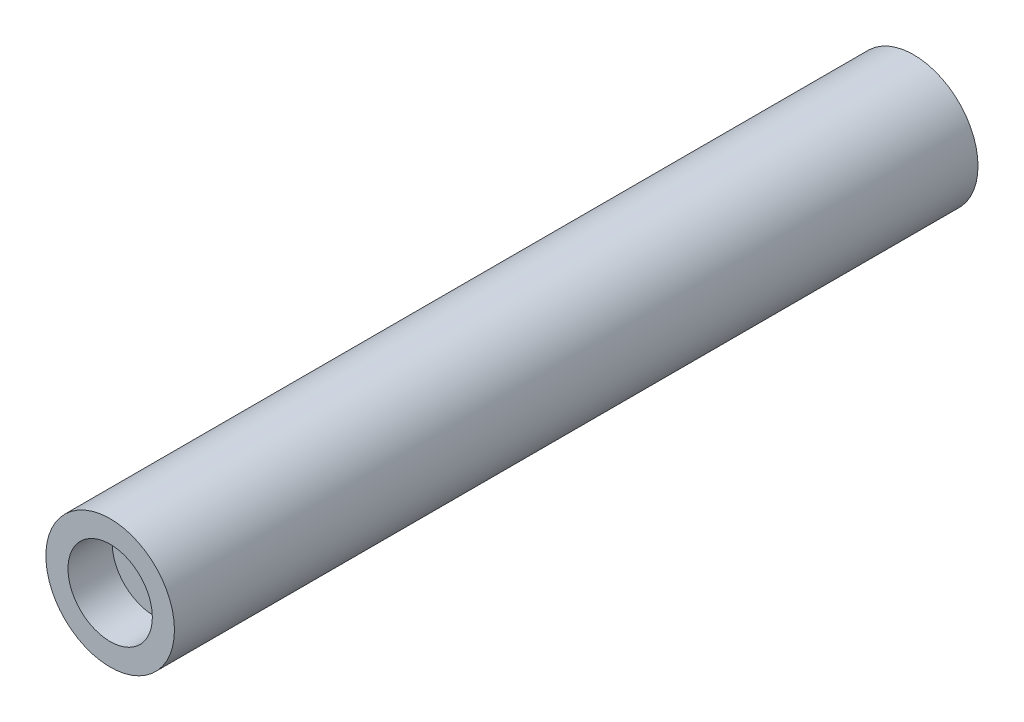
ISO-10303-21;
HEADER;
FILE_DESCRIPTION(('STEP AP214'),'2;1');
FILE_NAME('part.step','',(''),(''),'','','');
FILE_SCHEMA(('AUTOMOTIVE_DESIGN { 1 0 10303 214 1 1 1 1 }'));
ENDSEC;
DATA;
#1=APPLICATION_CONTEXT('core data for automotive mechanical design processes');
#2=APPLICATION_PROTOCOL_DEFINITION('international standard','automotive_design',2000,#1);
#3=PRODUCT_CONTEXT('',#1,'mechanical');
#4=PRODUCT('Part','Part','',(#3));
#5=PRODUCT_RELATED_PRODUCT_CATEGORY('part','',(#4));
#6=PRODUCT_DEFINITION_FORMATION('','',#4);
#7=PRODUCT_DEFINITION_CONTEXT('part definition',#1,'design');
#8=PRODUCT_DEFINITION('design','',#6,#7);
#9=PRODUCT_DEFINITION_SHAPE('','',#8);
#10=(LENGTH_UNIT() NAMED_UNIT(*) SI_UNIT(.MILLI.,.METRE.));
#11=(NAMED_UNIT(*) PLANE_ANGLE_UNIT() SI_UNIT($,.RADIAN.));
#12=(NAMED_UNIT(*) SI_UNIT($,.STERADIAN.) SOLID_ANGLE_UNIT());
#13=UNCERTAINTY_MEASURE_WITH_UNIT(LENGTH_MEASURE(1.E-05),#10,'distance_accuracy_value','');
#14=(GEOMETRIC_REPRESENTATION_CONTEXT(3) GLOBAL_UNCERTAINTY_ASSIGNED_CONTEXT((#13)) GLOBAL_UNIT_ASSIGNED_CONTEXT((#10,
#11,#12)) REPRESENTATION_CONTEXT('',''));
#15=CARTESIAN_POINT('',(0.,0.,0.));
#16=DIRECTION('',(0.,0.,1.));
#17=DIRECTION('',(1.,0.,0.));
#18=AXIS2_PLACEMENT_3D('',#15,#16,#17);
#19=CARTESIAN_POINT('',(0.,0.,100.));
#20=DIRECTION('',(0.,0.,-1.));
#21=DIRECTION('',(-1.,0.,0.));
#22=AXIS2_PLACEMENT_3D('',#19,#20,#21);
#23=CYLINDRICAL_SURFACE('',#22,8.);
#24=CARTESIAN_POINT('',(0.,0.,100.));
#25=DIRECTION('',(0.,0.,1.));
#26=DIRECTION('',(1.,0.,0.));
#27=AXIS2_PLACEMENT_3D('',#24,#25,#26);
#28=CIRCLE('',#27,8.);
#29=CARTESIAN_POINT('',(8.,0.,100.));
#30=VERTEX_POINT('',#29);
#31=EDGE_CURVE('E10',#30,#30,#28,.T.);
#32=ORIENTED_EDGE('',*,*,#31,.F.);
#33=EDGE_LOOP('',(#32));
#34=FACE_BOUND('',#33,.T.);
#35=CARTESIAN_POINT('',(0.,0.,0.));
#36=DIRECTION('',(0.,0.,1.));
#37=DIRECTION('',(1.,0.,0.));
#38=AXIS2_PLACEMENT_3D('',#35,#36,#37);
#39=CIRCLE('',#38,8.);
#40=CARTESIAN_POINT('',(8.,0.,0.));
#41=VERTEX_POINT('',#40);
#42=EDGE_CURVE('E46',#41,#41,#39,.T.);
#43=ORIENTED_EDGE('',*,*,#42,.T.);
#44=EDGE_LOOP('',(#43));
#45=FACE_BOUND('',#44,.T.);
#46=ADVANCED_FACE('F43',(#34,#45),#23,.T.);
#47=CARTESIAN_POINT('',(0.,0.,100.));
#48=DIRECTION('',(0.,0.,1.));
#49=DIRECTION('',(1.,0.,0.));
#50=AXIS2_PLACEMENT_3D('',#47,#48,#49);
#51=PLANE('',#50);
#52=CARTESIAN_POINT('',(0.,0.,100.));
#53=DIRECTION('',(0.,0.,1.));
#54=DIRECTION('',(1.,0.,0.));
#55=AXIS2_PLACEMENT_3D('',#52,#53,#54);
#56=CIRCLE('',#55,5.25);
#57=CARTESIAN_POINT('',(5.25,0.,100.));
#58=VERTEX_POINT('',#57);
#59=EDGE_CURVE('E65',#58,#58,#56,.T.);
#60=ORIENTED_EDGE('',*,*,#59,.F.);
#61=EDGE_LOOP('',(#60));
#62=FACE_BOUND('',#61,.T.);
#63=ORIENTED_EDGE('',*,*,#31,.T.);
#64=EDGE_LOOP('',(#63));
#65=FACE_BOUND('',#64,.T.);
#66=ADVANCED_FACE('F82',(#62,#65),#51,.T.);
#67=CARTESIAN_POINT('',(0.,0.,0.));
#68=DIRECTION('',(0.,0.,1.));
#69=DIRECTION('',(1.,0.,0.));
#70=AXIS2_PLACEMENT_3D('',#67,#68,#69);
#71=PLANE('',#70);
#72=CARTESIAN_POINT('',(0.,0.,0.));
#73=DIRECTION('',(0.,0.,-1.));
#74=DIRECTION('',(-1.,0.,0.));
#75=AXIS2_PLACEMENT_3D('',#72,#73,#74);
#76=CIRCLE('',#75,5.25);
#77=CARTESIAN_POINT('',(-5.25,0.,0.));
#78=VERTEX_POINT('',#77);
#79=EDGE_CURVE('E57',#78,#78,#76,.T.);
#80=ORIENTED_EDGE('',*,*,#79,.F.);
#81=EDGE_LOOP('',(#80));
#82=FACE_BOUND('',#81,.T.);
#83=ORIENTED_EDGE('',*,*,#42,.F.);
#84=EDGE_LOOP('',(#83));
#85=FACE_BOUND('',#84,.T.);
#86=ADVANCED_FACE('F84',(#82,#85),#71,.F.);
#87=CARTESIAN_POINT('',(0.,0.,21.));
#88=DIRECTION('',(0.,0.,-1.));
#89=DIRECTION('',(-1.,0.,0.));
#90=AXIS2_PLACEMENT_3D('',#87,#88,#89);
#91=CYLINDRICAL_SURFACE('',#90,5.25);
#92=CARTESIAN_POINT('',(0.,0.,21.));
#93=DIRECTION('',(0.,0.,-1.));
#94=DIRECTION('',(-1.,0.,0.));
#95=AXIS2_PLACEMENT_3D('',#92,#93,#94);
#96=CIRCLE('',#95,5.25);
#97=CARTESIAN_POINT('',(-5.25,0.,21.));
#98=VERTEX_POINT('',#97);
#99=EDGE_CURVE('E55',#98,#98,#96,.T.);
#100=CARTESIAN_POINT('',(-5.25,0.,21.));
#101=CARTESIAN_POINT('',(-5.25,0.,20.78125));
#102=CARTESIAN_POINT('',(-5.25,0.,20.5625));
#103=CARTESIAN_POINT('',(-5.25,0.,20.125));
#104=CARTESIAN_POINT('',(-5.25,0.,19.90625));
#105=CARTESIAN_POINT('',(-5.25,0.,19.46875));
#106=CARTESIAN_POINT('',(-5.25,0.,19.25));
#107=CARTESIAN_POINT('',(-5.25,0.,18.8125));
#108=CARTESIAN_POINT('',(-5.25,0.,18.59375));
#109=CARTESIAN_POINT('',(-5.25,0.,18.15625));
#110=CARTESIAN_POINT('',(-5.25,0.,17.9375));
#111=CARTESIAN_POINT('',(-5.25,0.,17.5));
#112=CARTESIAN_POINT('',(-5.25,0.,17.28125));
#113=CARTESIAN_POINT('',(-5.25,0.,16.84375));
#114=CARTESIAN_POINT('',(-5.25,0.,16.625));
#115=CARTESIAN_POINT('',(-5.25,0.,16.1875));
#116=CARTESIAN_POINT('',(-5.25,0.,15.96875));
#117=CARTESIAN_POINT('',(-5.25,0.,15.53125));
#118=CARTESIAN_POINT('',(-5.25,0.,15.3125));
#119=CARTESIAN_POINT('',(-5.25,0.,14.875));
#120=CARTESIAN_POINT('',(-5.25,0.,14.65625));
#121=CARTESIAN_POINT('',(-5.25,0.,14.21875));
#122=CARTESIAN_POINT('',(-5.25,0.,14.));
#123=CARTESIAN_POINT('',(-5.25,0.,13.5625));
#124=CARTESIAN_POINT('',(-5.25,0.,13.34375));
#125=CARTESIAN_POINT('',(-5.25,0.,12.90625));
#126=CARTESIAN_POINT('',(-5.25,0.,12.6875));
#127=CARTESIAN_POINT('',(-5.25,0.,12.25));
#128=CARTESIAN_POINT('',(-5.25,0.,12.03125));
#129=CARTESIAN_POINT('',(-5.25,0.,11.59375));
#130=CARTESIAN_POINT('',(-5.25,0.,11.375));
#131=CARTESIAN_POINT('',(-5.25,0.,10.9375));
#132=CARTESIAN_POINT('',(-5.25,0.,10.71875));
#133=CARTESIAN_POINT('',(-5.25,0.,10.28125));
#134=CARTESIAN_POINT('',(-5.25,0.,10.0625));
#135=CARTESIAN_POINT('',(-5.25,0.,9.625));
#136=CARTESIAN_POINT('',(-5.25,0.,9.40625));
#137=CARTESIAN_POINT('',(-5.25,0.,8.96875));
#138=CARTESIAN_POINT('',(-5.25,0.,8.75));
#139=CARTESIAN_POINT('',(-5.25,0.,8.3125));
#140=CARTESIAN_POINT('',(-5.25,0.,8.09375));
#141=CARTESIAN_POINT('',(-5.25,0.,7.65625));
#142=CARTESIAN_POINT('',(-5.25,0.,7.4375));
#143=CARTESIAN_POINT('',(-5.25,0.,7.));
#144=CARTESIAN_POINT('',(-5.25,0.,6.78125));
#145=CARTESIAN_POINT('',(-5.25,0.,6.34375));
#146=CARTESIAN_POINT('',(-5.25,0.,6.125));
#147=CARTESIAN_POINT('',(-5.25,0.,5.6875));
#148=CARTESIAN_POINT('',(-5.25,0.,5.46875));
#149=CARTESIAN_POINT('',(-5.25,0.,5.03125));
#150=CARTESIAN_POINT('',(-5.25,0.,4.8125));
#151=CARTESIAN_POINT('',(-5.25,0.,4.375));
#152=CARTESIAN_POINT('',(-5.25,0.,4.15625));
#153=CARTESIAN_POINT('',(-5.25,0.,3.71875));
#154=CARTESIAN_POINT('',(-5.25,0.,3.5));
#155=CARTESIAN_POINT('',(-5.25,0.,3.0625));
#156=CARTESIAN_POINT('',(-5.25,0.,2.84375));
#157=CARTESIAN_POINT('',(-5.25,0.,2.40625));
#158=CARTESIAN_POINT('',(-5.25,0.,2.1875));
#159=CARTESIAN_POINT('',(-5.25,0.,1.75));
#160=CARTESIAN_POINT('',(-5.25,0.,1.53125));
#161=CARTESIAN_POINT('',(-5.25,0.,1.09375));
#162=CARTESIAN_POINT('',(-5.25,0.,0.875000000000001));
#163=CARTESIAN_POINT('',(-5.25,0.,0.4375));
#164=CARTESIAN_POINT('',(-5.25,0.,0.21875));
#165=CARTESIAN_POINT('',(-5.25,0.,0.));
#166=B_SPLINE_CURVE_WITH_KNOTS('',3,(#100,#101,#102,#103,#104,#105,#106,#107,#108,#109,#110,
#111,#112,#113,#114,#115,#116,#117,#118,#119,#120,#121,#122,#123,#124,#125,#126,#127,#128,#129,
#130,#131,#132,#133,#134,#135,#136,#137,#138,#139,#140,#141,#142,#143,#144,#145,#146,#147,#148,
#149,#150,#151,#152,#153,#154,#155,#156,#157,#158,#159,#160,#161,#162,#163,#164,#165),
.UNSPECIFIED.,.F.,.F.,(4,2,2,2,2,2,2,2,2,2,2,2,2,2,2,2,2,2,2,2,2,2,2,2,2,2,2,2,2,2,2,2,4),(0.,
0.656250000000001,1.3125,1.96875,2.625,3.28125,3.9375,4.59375,5.25,5.90625,6.5625,7.21875,7.875,
8.53125,9.1875,9.84375,10.5,11.15625,11.8125,12.46875,13.125,13.78125,14.4375,15.09375,15.75,
16.40625,17.0625,17.71875,18.375,19.03125,19.6875,20.34375,21.),.UNSPECIFIED.);
#167=EDGE_CURVE('BSEAM90',#98,#78,#166,.T.);
#168=ORIENTED_EDGE('',*,*,#99,.F.);
#169=ORIENTED_EDGE('',*,*,#79,.T.);
#170=ORIENTED_EDGE('',*,*,#167,.T.);
#171=ORIENTED_EDGE('',*,*,#167,.F.);
#172=EDGE_LOOP('',(#168,#170,#169,#171));
#173=FACE_BOUND('',#172,.T.);
#174=ADVANCED_FACE('F90',(#173),#91,.F.);
#175=CARTESIAN_POINT('',(0.,0.,21.));
#176=DIRECTION('',(0.,0.,-1.));
#177=DIRECTION('',(-1.,0.,0.));
#178=AXIS2_PLACEMENT_3D('',#175,#176,#177);
#179=PLANE('',#178);
#180=ORIENTED_EDGE('',*,*,#99,.T.);
#181=EDGE_LOOP('',(#180));
#182=FACE_BOUND('',#181,.T.);
#183=ADVANCED_FACE('F78',(#182),#179,.T.);
#184=CARTESIAN_POINT('',(0.,0.,94.5));
#185=DIRECTION('',(0.,0.,1.));
#186=DIRECTION('',(1.,0.,0.));
#187=AXIS2_PLACEMENT_3D('',#184,#185,#186);
#188=CYLINDRICAL_SURFACE('',#187,5.25);
#189=CARTESIAN_POINT('',(0.,0.,94.5));
#190=DIRECTION('',(0.,0.,1.));
#191=DIRECTION('',(1.,0.,0.));
#192=AXIS2_PLACEMENT_3D('',#189,#190,#191);
#193=CIRCLE('',#192,5.25);
#194=CARTESIAN_POINT('',(5.25,0.,94.5));
#195=VERTEX_POINT('',#194);
#196=EDGE_CURVE('E61',#195,#195,#193,.T.);
#197=ORIENTED_EDGE('',*,*,#196,.F.);
#198=EDGE_LOOP('',(#197));
#199=FACE_BOUND('',#198,.T.);
#200=ORIENTED_EDGE('',*,*,#59,.T.);
#201=EDGE_LOOP('',(#200));
#202=FACE_BOUND('',#201,.T.);
#203=ADVANCED_FACE('F75',(#199,#202),#188,.F.);
#204=CARTESIAN_POINT('',(0.,0.,94.5));
#205=DIRECTION('',(0.,0.,1.));
#206=DIRECTION('',(1.,0.,0.));
#207=AXIS2_PLACEMENT_3D('',#204,#205,#206);
#208=PLANE('',#207);
#209=ORIENTED_EDGE('',*,*,#196,.T.);
#210=EDGE_LOOP('',(#209));
#211=FACE_BOUND('',#210,.T.);
#212=ADVANCED_FACE('F73',(#211),#208,.T.);
#213=CLOSED_SHELL('',(#46,#66,#86,#174,#183,#203,#212));
#214=MANIFOLD_SOLID_BREP('B2',#213);
#215=ADVANCED_BREP_SHAPE_REPRESENTATION('',(#18,#214),#14);
#216=SHAPE_DEFINITION_REPRESENTATION(#9,#215);
ENDSEC;
END-ISO-10303-21;
